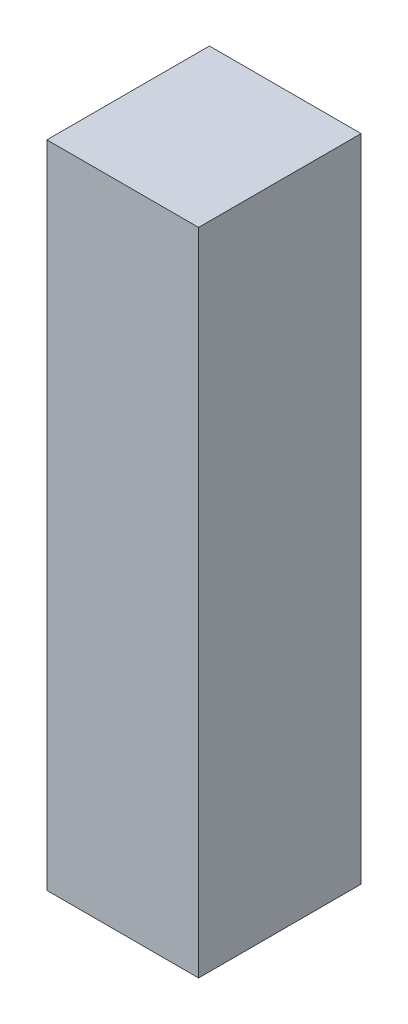
ISO-10303-21;
HEADER;
FILE_DESCRIPTION(('STEP AP214'),'2;1');
FILE_NAME('part.step','',(''),(''),'','','');
FILE_SCHEMA(('AUTOMOTIVE_DESIGN { 1 0 10303 214 1 1 1 1 }'));
ENDSEC;
DATA;
#1=APPLICATION_CONTEXT('core data for automotive mechanical design processes');
#2=APPLICATION_PROTOCOL_DEFINITION('international standard','automotive_design',2000,#1);
#3=PRODUCT_CONTEXT('',#1,'mechanical');
#4=PRODUCT('Part','Part','',(#3));
#5=PRODUCT_RELATED_PRODUCT_CATEGORY('part','',(#4));
#6=PRODUCT_DEFINITION_FORMATION('','',#4);
#7=PRODUCT_DEFINITION_CONTEXT('part definition',#1,'design');
#8=PRODUCT_DEFINITION('design','',#6,#7);
#9=PRODUCT_DEFINITION_SHAPE('','',#8);
#10=(LENGTH_UNIT() NAMED_UNIT(*) SI_UNIT(.MILLI.,.METRE.));
#11=(NAMED_UNIT(*) PLANE_ANGLE_UNIT() SI_UNIT($,.RADIAN.));
#12=(NAMED_UNIT(*) SI_UNIT($,.STERADIAN.) SOLID_ANGLE_UNIT());
#13=UNCERTAINTY_MEASURE_WITH_UNIT(LENGTH_MEASURE(1.E-05),#10,'distance_accuracy_value','');
#14=(GEOMETRIC_REPRESENTATION_CONTEXT(3) GLOBAL_UNCERTAINTY_ASSIGNED_CONTEXT((#13)) GLOBAL_UNIT_ASSIGNED_CONTEXT((#10,
#11,#12)) REPRESENTATION_CONTEXT('',''));
#15=CARTESIAN_POINT('',(0.,0.,0.));
#16=DIRECTION('',(0.,0.,1.));
#17=DIRECTION('',(1.,0.,0.));
#18=AXIS2_PLACEMENT_3D('',#15,#16,#17);
#19=CARTESIAN_POINT('',(0.,30.,0.));
#20=DIRECTION('',(1.,0.,0.));
#21=DIRECTION('',(0.,0.,-1.));
#22=AXIS2_PLACEMENT_3D('',#19,#20,#21);
#23=PLANE('',#22);
#24=DIRECTION('',(0.,0.,1.));
#25=VECTOR('',#24,1.);
#26=CARTESIAN_POINT('',(0.,0.,0.));
#27=LINE('',#26,#25);
#28=CARTESIAN_POINT('',(0.,0.,0.));
#29=VERTEX_POINT('',#28);
#30=CARTESIAN_POINT('',(0.,0.,7.5));
#31=VERTEX_POINT('',#30);
#32=EDGE_CURVE('E94',#29,#31,#27,.T.);
#33=ORIENTED_EDGE('',*,*,#32,.T.);
#34=DIRECTION('',(0.,-1.,0.));
#35=VECTOR('',#34,1.);
#36=CARTESIAN_POINT('',(0.,30.,7.5));
#37=LINE('',#36,#35);
#38=CARTESIAN_POINT('',(0.,30.,7.5));
#39=VERTEX_POINT('',#38);
#40=EDGE_CURVE('E11',#39,#31,#37,.T.);
#41=ORIENTED_EDGE('',*,*,#40,.F.);
#42=DIRECTION('',(0.,0.,1.));
#43=VECTOR('',#42,1.);
#44=CARTESIAN_POINT('',(0.,30.,0.));
#45=LINE('',#44,#43);
#46=CARTESIAN_POINT('',(0.,30.,0.));
#47=VERTEX_POINT('',#46);
#48=EDGE_CURVE('E82',#47,#39,#45,.T.);
#49=ORIENTED_EDGE('',*,*,#48,.F.);
#50=DIRECTION('',(0.,-1.,0.));
#51=VECTOR('',#50,1.);
#52=CARTESIAN_POINT('',(0.,30.,0.));
#53=LINE('',#52,#51);
#54=EDGE_CURVE('E90',#47,#29,#53,.T.);
#55=ORIENTED_EDGE('',*,*,#54,.T.);
#56=EDGE_LOOP('',(#33,#41,#49,#55));
#57=FACE_BOUND('',#56,.T.);
#58=ADVANCED_FACE('F31',(#57),#23,.F.);
#59=CARTESIAN_POINT('',(0.,30.,7.5));
#60=DIRECTION('',(0.,0.,-1.));
#61=DIRECTION('',(-1.,0.,0.));
#62=AXIS2_PLACEMENT_3D('',#59,#60,#61);
#63=PLANE('',#62);
#64=DIRECTION('',(1.,0.,0.));
#65=VECTOR('',#64,1.);
#66=CARTESIAN_POINT('',(0.,0.,7.5));
#67=LINE('',#66,#65);
#68=CARTESIAN_POINT('',(7.,0.,7.5));
#69=VERTEX_POINT('',#68);
#70=EDGE_CURVE('E86',#31,#69,#67,.T.);
#71=ORIENTED_EDGE('',*,*,#70,.T.);
#72=DIRECTION('',(0.,-1.,0.));
#73=VECTOR('',#72,1.);
#74=CARTESIAN_POINT('',(7.,30.,7.5));
#75=LINE('',#74,#73);
#76=CARTESIAN_POINT('',(7.,30.,7.5));
#77=VERTEX_POINT('',#76);
#78=EDGE_CURVE('E39',#77,#69,#75,.T.);
#79=ORIENTED_EDGE('',*,*,#78,.F.);
#80=DIRECTION('',(1.,0.,0.));
#81=VECTOR('',#80,1.);
#82=CARTESIAN_POINT('',(0.,30.,7.5));
#83=LINE('',#82,#81);
#84=EDGE_CURVE('E77',#39,#77,#83,.T.);
#85=ORIENTED_EDGE('',*,*,#84,.F.);
#86=ORIENTED_EDGE('',*,*,#40,.T.);
#87=EDGE_LOOP('',(#71,#79,#85,#86));
#88=FACE_BOUND('',#87,.T.);
#89=ADVANCED_FACE('F85',(#88),#63,.F.);
#90=CARTESIAN_POINT('',(7.,30.,0.));
#91=DIRECTION('',(-1.,0.,0.));
#92=DIRECTION('',(0.,0.,1.));
#93=AXIS2_PLACEMENT_3D('',#90,#91,#92);
#94=PLANE('',#93);
#95=DIRECTION('',(0.,0.,-1.));
#96=VECTOR('',#95,1.);
#97=CARTESIAN_POINT('',(7.,0.,0.));
#98=LINE('',#97,#96);
#99=CARTESIAN_POINT('',(7.,0.,0.));
#100=VERTEX_POINT('',#99);
#101=EDGE_CURVE('E64',#69,#100,#98,.T.);
#102=ORIENTED_EDGE('',*,*,#101,.T.);
#103=DIRECTION('',(0.,-1.,0.));
#104=VECTOR('',#103,1.);
#105=CARTESIAN_POINT('',(7.,30.,0.));
#106=LINE('',#105,#104);
#107=CARTESIAN_POINT('',(7.,30.,0.));
#108=VERTEX_POINT('',#107);
#109=EDGE_CURVE('E87',#108,#100,#106,.T.);
#110=ORIENTED_EDGE('',*,*,#109,.F.);
#111=DIRECTION('',(0.,0.,-1.));
#112=VECTOR('',#111,1.);
#113=CARTESIAN_POINT('',(7.,30.,0.));
#114=LINE('',#113,#112);
#115=EDGE_CURVE('E80',#77,#108,#114,.T.);
#116=ORIENTED_EDGE('',*,*,#115,.F.);
#117=ORIENTED_EDGE('',*,*,#78,.T.);
#118=EDGE_LOOP('',(#102,#110,#116,#117));
#119=FACE_BOUND('',#118,.T.);
#120=ADVANCED_FACE('F88',(#119),#94,.F.);
#121=CARTESIAN_POINT('',(0.,30.,0.));
#122=DIRECTION('',(0.,0.,1.));
#123=DIRECTION('',(1.,0.,0.));
#124=AXIS2_PLACEMENT_3D('',#121,#122,#123);
#125=PLANE('',#124);
#126=DIRECTION('',(-1.,0.,0.));
#127=VECTOR('',#126,1.);
#128=CARTESIAN_POINT('',(0.,0.,0.));
#129=LINE('',#128,#127);
#130=EDGE_CURVE('E70',#100,#29,#129,.T.);
#131=ORIENTED_EDGE('',*,*,#130,.T.);
#132=ORIENTED_EDGE('',*,*,#54,.F.);
#133=DIRECTION('',(-1.,0.,0.));
#134=VECTOR('',#133,1.);
#135=CARTESIAN_POINT('',(0.,30.,0.));
#136=LINE('',#135,#134);
#137=EDGE_CURVE('E47',#108,#47,#136,.T.);
#138=ORIENTED_EDGE('',*,*,#137,.F.);
#139=ORIENTED_EDGE('',*,*,#109,.T.);
#140=EDGE_LOOP('',(#131,#132,#138,#139));
#141=FACE_BOUND('',#140,.T.);
#142=ADVANCED_FACE('F101',(#141),#125,.F.);
#143=CARTESIAN_POINT('',(0.,30.,7.5));
#144=DIRECTION('',(0.,1.,0.));
#145=DIRECTION('',(0.,0.,1.));
#146=AXIS2_PLACEMENT_3D('',#143,#144,#145);
#147=PLANE('',#146);
#148=ORIENTED_EDGE('',*,*,#48,.T.);
#149=ORIENTED_EDGE('',*,*,#84,.T.);
#150=ORIENTED_EDGE('',*,*,#115,.T.);
#151=ORIENTED_EDGE('',*,*,#137,.T.);
#152=EDGE_LOOP('',(#148,#149,#150,#151));
#153=FACE_BOUND('',#152,.T.);
#154=ADVANCED_FACE('F78',(#153),#147,.T.);
#155=CARTESIAN_POINT('',(0.,0.,7.5));
#156=DIRECTION('',(0.,1.,0.));
#157=DIRECTION('',(0.,0.,1.));
#158=AXIS2_PLACEMENT_3D('',#155,#156,#157);
#159=PLANE('',#158);
#160=ORIENTED_EDGE('',*,*,#32,.F.);
#161=ORIENTED_EDGE('',*,*,#130,.F.);
#162=ORIENTED_EDGE('',*,*,#101,.F.);
#163=ORIENTED_EDGE('',*,*,#70,.F.);
#164=EDGE_LOOP('',(#160,#161,#162,#163));
#165=FACE_BOUND('',#164,.T.);
#166=ADVANCED_FACE('F104',(#165),#159,.F.);
#167=CLOSED_SHELL('',(#58,#89,#120,#142,#154,#166));
#168=MANIFOLD_SOLID_BREP('B2',#167);
#169=ADVANCED_BREP_SHAPE_REPRESENTATION('',(#18,#168),#14);
#170=SHAPE_DEFINITION_REPRESENTATION(#9,#169);
ENDSEC;
END-ISO-10303-21;
